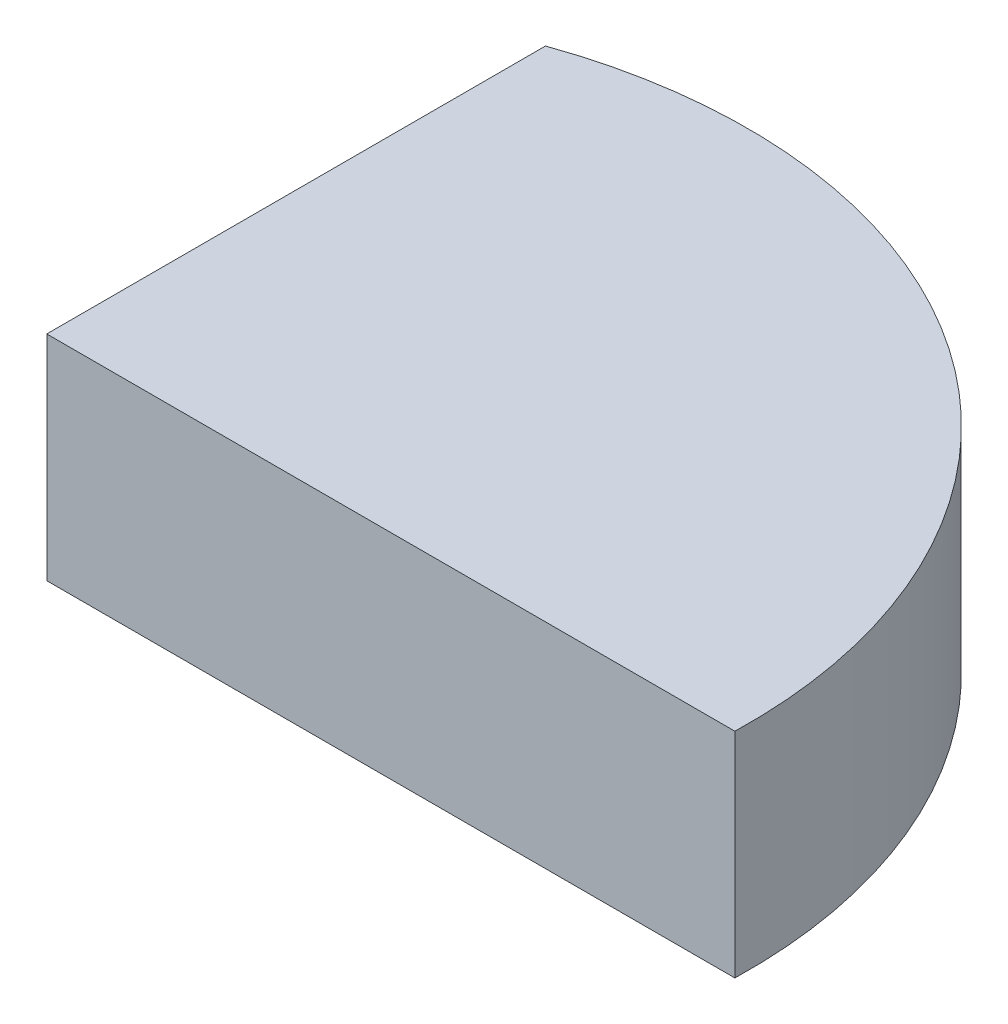
ISO-10303-21;
HEADER;
FILE_DESCRIPTION(('STEP AP214'),'2;1');
FILE_NAME('part.step','',(''),(''),'','','');
FILE_SCHEMA(('AUTOMOTIVE_DESIGN { 1 0 10303 214 1 1 1 1 }'));
ENDSEC;
DATA;
#1=APPLICATION_CONTEXT('core data for automotive mechanical design processes');
#2=APPLICATION_PROTOCOL_DEFINITION('international standard','automotive_design',2000,#1);
#3=PRODUCT_CONTEXT('',#1,'mechanical');
#4=PRODUCT('Part','Part','',(#3));
#5=PRODUCT_RELATED_PRODUCT_CATEGORY('part','',(#4));
#6=PRODUCT_DEFINITION_FORMATION('','',#4);
#7=PRODUCT_DEFINITION_CONTEXT('part definition',#1,'design');
#8=PRODUCT_DEFINITION('design','',#6,#7);
#9=PRODUCT_DEFINITION_SHAPE('','',#8);
#10=(LENGTH_UNIT() NAMED_UNIT(*) SI_UNIT(.MILLI.,.METRE.));
#11=(NAMED_UNIT(*) PLANE_ANGLE_UNIT() SI_UNIT($,.RADIAN.));
#12=(NAMED_UNIT(*) SI_UNIT($,.STERADIAN.) SOLID_ANGLE_UNIT());
#13=UNCERTAINTY_MEASURE_WITH_UNIT(LENGTH_MEASURE(1.E-05),#10,'distance_accuracy_value','');
#14=(GEOMETRIC_REPRESENTATION_CONTEXT(3) GLOBAL_UNCERTAINTY_ASSIGNED_CONTEXT((#13)) GLOBAL_UNIT_ASSIGNED_CONTEXT((#10,
#11,#12)) REPRESENTATION_CONTEXT('',''));
#15=CARTESIAN_POINT('',(0.,0.,0.));
#16=DIRECTION('',(0.,0.,1.));
#17=DIRECTION('',(1.,0.,0.));
#18=AXIS2_PLACEMENT_3D('',#15,#16,#17);
#19=CARTESIAN_POINT('',(0.,19.05,0.));
#20=DIRECTION('',(0.,0.,-1.));
#21=DIRECTION('',(-1.,0.,0.));
#22=AXIS2_PLACEMENT_3D('',#19,#20,#21);
#23=PLANE('',#22);
#24=DIRECTION('',(1.,0.,0.));
#25=VECTOR('',#24,1.);
#26=CARTESIAN_POINT('',(0.,0.,0.));
#27=LINE('',#26,#25);
#28=CARTESIAN_POINT('',(0.,0.,0.));
#29=VERTEX_POINT('',#28);
#30=CARTESIAN_POINT('',(61.3329420981827,0.,0.));
#31=VERTEX_POINT('',#30);
#32=EDGE_CURVE('E82',#29,#31,#27,.T.);
#33=ORIENTED_EDGE('',*,*,#32,.T.);
#34=DIRECTION('',(0.,-1.,0.));
#35=VECTOR('',#34,1.);
#36=CARTESIAN_POINT('',(61.3329420981827,19.05,0.));
#37=LINE('',#36,#35);
#38=CARTESIAN_POINT('',(61.3329420981827,19.05,0.));
#39=VERTEX_POINT('',#38);
#40=EDGE_CURVE('E11',#39,#31,#37,.T.);
#41=ORIENTED_EDGE('',*,*,#40,.F.);
#42=DIRECTION('',(1.,0.,0.));
#43=VECTOR('',#42,1.);
#44=CARTESIAN_POINT('',(0.,19.05,0.));
#45=LINE('',#44,#43);
#46=CARTESIAN_POINT('',(0.,19.05,0.));
#47=VERTEX_POINT('',#46);
#48=EDGE_CURVE('E75',#47,#39,#45,.T.);
#49=ORIENTED_EDGE('',*,*,#48,.F.);
#50=DIRECTION('',(0.,-1.,0.));
#51=VECTOR('',#50,1.);
#52=CARTESIAN_POINT('',(0.,19.05,0.));
#53=LINE('',#52,#51);
#54=EDGE_CURVE('E83',#47,#29,#53,.T.);
#55=ORIENTED_EDGE('',*,*,#54,.T.);
#56=EDGE_LOOP('',(#33,#41,#49,#55));
#57=FACE_BOUND('',#56,.T.);
#58=ADVANCED_FACE('F35',(#57),#23,.F.);
#59=CARTESIAN_POINT('',(15.389187233177,19.05,-1.14511780204766));
#60=DIRECTION('',(0.,-1.,0.));
#61=DIRECTION('',(0.,0.,-1.));
#62=AXIS2_PLACEMENT_3D('',#59,#60,#61);
#63=CYLINDRICAL_SURFACE('',#62,45.9580233025345);
#64=CARTESIAN_POINT('',(15.389187233177,0.,-1.14511780204766));
#65=DIRECTION('',(0.,1.,0.));
#66=DIRECTION('',(0.,0.,-1.));
#67=AXIS2_PLACEMENT_3D('',#64,#65,#66);
#68=CIRCLE('',#67,45.9580233025345);
#69=CARTESIAN_POINT('',(0.,0.,-44.45));
#70=VERTEX_POINT('',#69);
#71=EDGE_CURVE('E63',#31,#70,#68,.T.);
#72=ORIENTED_EDGE('',*,*,#71,.T.);
#73=DIRECTION('',(0.,-1.,0.));
#74=VECTOR('',#73,1.);
#75=CARTESIAN_POINT('',(0.,19.05,-44.45));
#76=LINE('',#75,#74);
#77=CARTESIAN_POINT('',(0.,19.05,-44.45));
#78=VERTEX_POINT('',#77);
#79=EDGE_CURVE('E43',#78,#70,#76,.T.);
#80=ORIENTED_EDGE('',*,*,#79,.F.);
#81=CARTESIAN_POINT('',(15.389187233177,19.05,-1.14511780204766));
#82=DIRECTION('',(0.,1.,0.));
#83=DIRECTION('',(0.,0.,-1.));
#84=AXIS2_PLACEMENT_3D('',#81,#82,#83);
#85=CIRCLE('',#84,45.9580233025345);
#86=EDGE_CURVE('E71',#39,#78,#85,.T.);
#87=ORIENTED_EDGE('',*,*,#86,.F.);
#88=ORIENTED_EDGE('',*,*,#40,.T.);
#89=EDGE_LOOP('',(#72,#80,#87,#88));
#90=FACE_BOUND('',#89,.T.);
#91=ADVANCED_FACE('F72',(#90),#63,.T.);
#92=CARTESIAN_POINT('',(0.,19.05,0.));
#93=DIRECTION('',(1.,0.,0.));
#94=DIRECTION('',(0.,0.,-1.));
#95=AXIS2_PLACEMENT_3D('',#92,#93,#94);
#96=PLANE('',#95);
#97=DIRECTION('',(0.,0.,1.));
#98=VECTOR('',#97,1.);
#99=CARTESIAN_POINT('',(0.,0.,0.));
#100=LINE('',#99,#98);
#101=EDGE_CURVE('E68',#70,#29,#100,.T.);
#102=ORIENTED_EDGE('',*,*,#101,.T.);
#103=ORIENTED_EDGE('',*,*,#54,.F.);
#104=DIRECTION('',(0.,0.,1.));
#105=VECTOR('',#104,1.);
#106=CARTESIAN_POINT('',(0.,19.05,0.));
#107=LINE('',#106,#105);
#108=EDGE_CURVE('E51',#78,#47,#107,.T.);
#109=ORIENTED_EDGE('',*,*,#108,.F.);
#110=ORIENTED_EDGE('',*,*,#79,.T.);
#111=EDGE_LOOP('',(#102,#103,#109,#110));
#112=FACE_BOUND('',#111,.T.);
#113=ADVANCED_FACE('F90',(#112),#96,.F.);
#114=CARTESIAN_POINT('',(15.389187233177,19.05,-1.14511780204766));
#115=DIRECTION('',(0.,-1.,0.));
#116=DIRECTION('',(0.,0.,-1.));
#117=AXIS2_PLACEMENT_3D('',#114,#115,#116);
#118=PLANE('',#117);
#119=ORIENTED_EDGE('',*,*,#48,.T.);
#120=ORIENTED_EDGE('',*,*,#86,.T.);
#121=ORIENTED_EDGE('',*,*,#108,.T.);
#122=EDGE_LOOP('',(#119,#120,#121));
#123=FACE_BOUND('',#122,.T.);
#124=ADVANCED_FACE('F78',(#123),#118,.F.);
#125=CARTESIAN_POINT('',(15.389187233177,0.,-1.14511780204766));
#126=DIRECTION('',(0.,-1.,0.));
#127=DIRECTION('',(0.,0.,-1.));
#128=AXIS2_PLACEMENT_3D('',#125,#126,#127);
#129=PLANE('',#128);
#130=ORIENTED_EDGE('',*,*,#32,.F.);
#131=ORIENTED_EDGE('',*,*,#101,.F.);
#132=ORIENTED_EDGE('',*,*,#71,.F.);
#133=EDGE_LOOP('',(#130,#131,#132));
#134=FACE_BOUND('',#133,.T.);
#135=ADVANCED_FACE('F91',(#134),#129,.T.);
#136=CLOSED_SHELL('',(#58,#91,#113,#124,#135));
#137=MANIFOLD_SOLID_BREP('B2',#136);
#138=ADVANCED_BREP_SHAPE_REPRESENTATION('',(#18,#137),#14);
#139=SHAPE_DEFINITION_REPRESENTATION(#9,#138);
ENDSEC;
END-ISO-10303-21;
